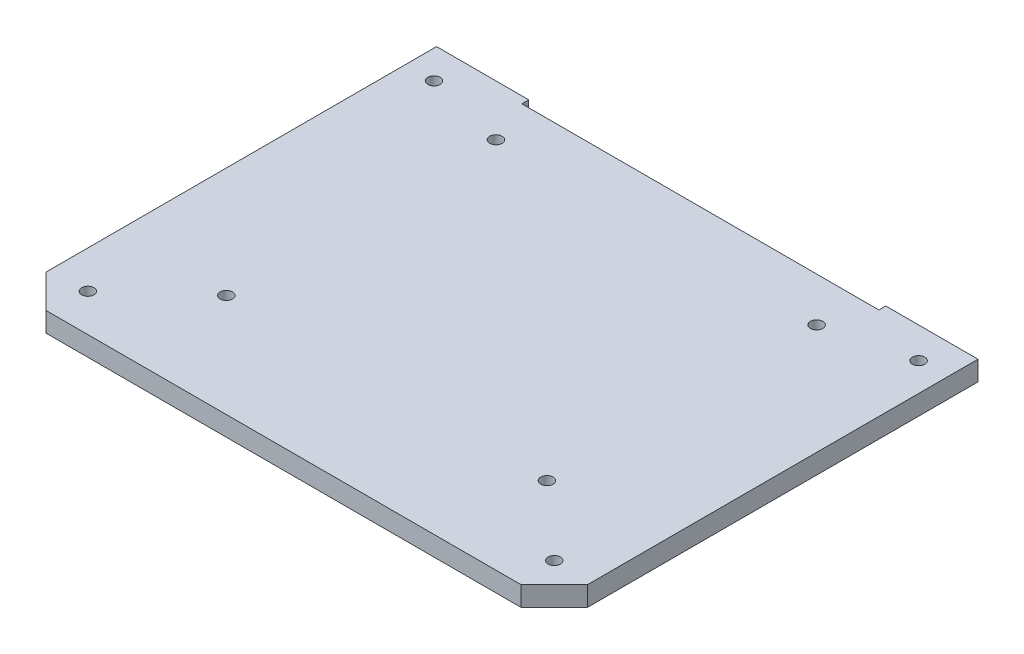
ISO-10303-21;
HEADER;
FILE_DESCRIPTION(('STEP AP214'),'2;1');
FILE_NAME('part.step','',(''),(''),'','','');
FILE_SCHEMA(('AUTOMOTIVE_DESIGN { 1 0 10303 214 1 1 1 1 }'));
ENDSEC;
DATA;
#1=APPLICATION_CONTEXT('core data for automotive mechanical design processes');
#2=APPLICATION_PROTOCOL_DEFINITION('international standard','automotive_design',2000,#1);
#3=PRODUCT_CONTEXT('',#1,'mechanical');
#4=PRODUCT('Part','Part','',(#3));
#5=PRODUCT_RELATED_PRODUCT_CATEGORY('part','',(#4));
#6=PRODUCT_DEFINITION_FORMATION('','',#4);
#7=PRODUCT_DEFINITION_CONTEXT('part definition',#1,'design');
#8=PRODUCT_DEFINITION('design','',#6,#7);
#9=PRODUCT_DEFINITION_SHAPE('','',#8);
#10=(LENGTH_UNIT() NAMED_UNIT(*) SI_UNIT(.MILLI.,.METRE.));
#11=(NAMED_UNIT(*) PLANE_ANGLE_UNIT() SI_UNIT($,.RADIAN.));
#12=(NAMED_UNIT(*) SI_UNIT($,.STERADIAN.) SOLID_ANGLE_UNIT());
#13=UNCERTAINTY_MEASURE_WITH_UNIT(LENGTH_MEASURE(1.E-05),#10,'distance_accuracy_value','');
#14=(GEOMETRIC_REPRESENTATION_CONTEXT(3) GLOBAL_UNCERTAINTY_ASSIGNED_CONTEXT((#13)) GLOBAL_UNIT_ASSIGNED_CONTEXT((#10,
#11,#12)) REPRESENTATION_CONTEXT('',''));
#15=CARTESIAN_POINT('',(0.,0.,0.));
#16=DIRECTION('',(0.,0.,1.));
#17=DIRECTION('',(1.,0.,0.));
#18=AXIS2_PLACEMENT_3D('',#15,#16,#17);
#19=CARTESIAN_POINT('',(74.3,30.4,11.9));
#20=DIRECTION('',(0.,0.,1.));
#21=DIRECTION('',(1.,0.,0.));
#22=AXIS2_PLACEMENT_3D('',#19,#20,#21);
#23=PLANE('',#22);
#24=DIRECTION('',(0.,-1.,0.));
#25=VECTOR('',#24,1.);
#26=CARTESIAN_POINT('',(49.,30.4,11.9));
#27=LINE('',#26,#25);
#28=CARTESIAN_POINT('',(49.,30.4,11.9));
#29=VERTEX_POINT('',#28);
#30=CARTESIAN_POINT('',(49.,28.,11.9));
#31=VERTEX_POINT('',#30);
#32=EDGE_CURVE('E56',#29,#31,#27,.T.);
#33=ORIENTED_EDGE('',*,*,#32,.T.);
#34=DIRECTION('',(-1.,0.,0.));
#35=VECTOR('',#34,1.);
#36=CARTESIAN_POINT('',(74.3,28.,11.9));
#37=LINE('',#36,#35);
#38=CARTESIAN_POINT('',(-49.,28.,11.9));
#39=VERTEX_POINT('',#38);
#40=EDGE_CURVE('E275',#31,#39,#37,.T.);
#41=ORIENTED_EDGE('',*,*,#40,.T.);
#42=DIRECTION('',(0.,-1.,0.));
#43=VECTOR('',#42,1.);
#44=CARTESIAN_POINT('',(-49.,30.4,11.9));
#45=LINE('',#44,#43);
#46=CARTESIAN_POINT('',(-49.,30.4,11.9));
#47=VERTEX_POINT('',#46);
#48=EDGE_CURVE('E218',#47,#39,#45,.T.);
#49=ORIENTED_EDGE('',*,*,#48,.F.);
#50=DIRECTION('',(-1.,0.,0.));
#51=VECTOR('',#50,1.);
#52=CARTESIAN_POINT('',(74.3,30.4,11.9));
#53=LINE('',#52,#51);
#54=EDGE_CURVE('E61',#29,#47,#53,.T.);
#55=ORIENTED_EDGE('',*,*,#54,.F.);
#56=EDGE_LOOP('',(#33,#41,#49,#55));
#57=FACE_BOUND('',#56,.T.);
#58=ADVANCED_FACE('F39',(#57),#23,.F.);
#59=CARTESIAN_POINT('',(0.,28.,0.));
#60=DIRECTION('',(0.,1.,0.));
#61=DIRECTION('',(0.,0.,1.));
#62=AXIS2_PLACEMENT_3D('',#59,#60,#61);
#63=PLANE('',#62);
#64=CARTESIAN_POINT('',(-44.,28.,24.));
#65=DIRECTION('',(0.,1.,0.));
#66=DIRECTION('',(0.,0.,1.));
#67=AXIS2_PLACEMENT_3D('',#64,#65,#66);
#68=CIRCLE('',#67,1.7);
#69=CARTESIAN_POINT('',(-44.,28.,25.7));
#70=VERTEX_POINT('',#69);
#71=EDGE_CURVE('E193',#70,#70,#68,.F.);
#72=ORIENTED_EDGE('',*,*,#71,.F.);
#73=EDGE_LOOP('',(#72));
#74=FACE_BOUND('',#73,.T.);
#75=CARTESIAN_POINT('',(64.,28.,116.));
#76=DIRECTION('',(0.,1.,0.));
#77=DIRECTION('',(0.,0.,1.));
#78=AXIS2_PLACEMENT_3D('',#75,#76,#77);
#79=CIRCLE('',#78,1.69999999999999);
#80=CARTESIAN_POINT('',(64.,28.,117.7));
#81=VERTEX_POINT('',#80);
#82=EDGE_CURVE('E315',#81,#81,#79,.F.);
#83=ORIENTED_EDGE('',*,*,#82,.F.);
#84=EDGE_LOOP('',(#83));
#85=FACE_BOUND('',#84,.T.);
#86=CARTESIAN_POINT('',(-64.,28.,116.));
#87=DIRECTION('',(0.,1.,0.));
#88=DIRECTION('',(0.,0.,1.));
#89=AXIS2_PLACEMENT_3D('',#86,#87,#88);
#90=CIRCLE('',#89,1.7);
#91=CARTESIAN_POINT('',(-64.,28.,117.7));
#92=VERTEX_POINT('',#91);
#93=EDGE_CURVE('E312',#92,#92,#90,.F.);
#94=ORIENTED_EDGE('',*,*,#93,.F.);
#95=EDGE_LOOP('',(#94));
#96=FACE_BOUND('',#95,.T.);
#97=CARTESIAN_POINT('',(66.5,28.,18.5));
#98=DIRECTION('',(0.,1.,0.));
#99=DIRECTION('',(0.,0.,1.));
#100=AXIS2_PLACEMENT_3D('',#97,#98,#99);
#101=CIRCLE('',#100,1.69999999999999);
#102=CARTESIAN_POINT('',(66.5,28.,20.2));
#103=VERTEX_POINT('',#102);
#104=EDGE_CURVE('E309',#103,#103,#101,.F.);
#105=ORIENTED_EDGE('',*,*,#104,.F.);
#106=EDGE_LOOP('',(#105));
#107=FACE_BOUND('',#106,.T.);
#108=CARTESIAN_POINT('',(44.,28.,98.));
#109=DIRECTION('',(0.,1.,0.));
#110=DIRECTION('',(0.,0.,1.));
#111=AXIS2_PLACEMENT_3D('',#108,#109,#110);
#112=CIRCLE('',#111,1.7);
#113=CARTESIAN_POINT('',(44.,28.,99.7));
#114=VERTEX_POINT('',#113);
#115=EDGE_CURVE('E305',#114,#114,#112,.F.);
#116=ORIENTED_EDGE('',*,*,#115,.F.);
#117=EDGE_LOOP('',(#116));
#118=FACE_BOUND('',#117,.T.);
#119=CARTESIAN_POINT('',(44.,28.,24.));
#120=DIRECTION('',(0.,1.,0.));
#121=DIRECTION('',(0.,0.,1.));
#122=AXIS2_PLACEMENT_3D('',#119,#120,#121);
#123=CIRCLE('',#122,1.7);
#124=CARTESIAN_POINT('',(44.,28.,25.7));
#125=VERTEX_POINT('',#124);
#126=EDGE_CURVE('E301',#125,#125,#123,.F.);
#127=ORIENTED_EDGE('',*,*,#126,.F.);
#128=EDGE_LOOP('',(#127));
#129=FACE_BOUND('',#128,.T.);
#130=CARTESIAN_POINT('',(-44.,28.,98.));
#131=DIRECTION('',(0.,1.,0.));
#132=DIRECTION('',(0.,0.,1.));
#133=AXIS2_PLACEMENT_3D('',#130,#131,#132);
#134=CIRCLE('',#133,1.7);
#135=CARTESIAN_POINT('',(-44.,28.,99.7));
#136=VERTEX_POINT('',#135);
#137=EDGE_CURVE('E297',#136,#136,#134,.F.);
#138=ORIENTED_EDGE('',*,*,#137,.F.);
#139=EDGE_LOOP('',(#138));
#140=FACE_BOUND('',#139,.T.);
#141=CARTESIAN_POINT('',(-66.5,28.,18.5));
#142=DIRECTION('',(0.,1.,0.));
#143=DIRECTION('',(0.,0.,1.));
#144=AXIS2_PLACEMENT_3D('',#141,#142,#143);
#145=CIRCLE('',#144,1.69999999999999);
#146=CARTESIAN_POINT('',(-66.5,28.,20.2));
#147=VERTEX_POINT('',#146);
#148=EDGE_CURVE('E293',#147,#147,#145,.F.);
#149=ORIENTED_EDGE('',*,*,#148,.F.);
#150=EDGE_LOOP('',(#149));
#151=FACE_BOUND('',#150,.T.);
#152=DIRECTION('',(0.,0.,-1.));
#153=VECTOR('',#152,1.);
#154=CARTESIAN_POINT('',(72.7,28.,0.));
#155=LINE('',#154,#153);
#156=CARTESIAN_POINT('',(72.7,28.,116.524264068712));
#157=VERTEX_POINT('',#156);
#158=CARTESIAN_POINT('',(72.7,28.,11.9));
#159=VERTEX_POINT('',#158);
#160=EDGE_CURVE('E11',#157,#159,#155,.T.);
#161=ORIENTED_EDGE('',*,*,#160,.F.);
#162=DIRECTION('',(0.707106781186547,0.,-0.707106781186548));
#163=VECTOR('',#162,1.);
#164=CARTESIAN_POINT('',(94.612132034356,28.,94.6121320343559));
#165=LINE('',#164,#163);
#166=CARTESIAN_POINT('',(64.5242640687119,28.,124.7));
#167=VERTEX_POINT('',#166);
#168=EDGE_CURVE('E48',#167,#157,#165,.T.);
#169=ORIENTED_EDGE('',*,*,#168,.F.);
#170=DIRECTION('',(1.,0.,0.));
#171=VECTOR('',#170,1.);
#172=CARTESIAN_POINT('',(0.,28.,124.7));
#173=LINE('',#172,#171);
#174=CARTESIAN_POINT('',(-64.5242640687119,28.,124.7));
#175=VERTEX_POINT('',#174);
#176=EDGE_CURVE('E287',#175,#167,#173,.T.);
#177=ORIENTED_EDGE('',*,*,#176,.F.);
#178=DIRECTION('',(0.707106781186547,0.,0.707106781186548));
#179=VECTOR('',#178,1.);
#180=CARTESIAN_POINT('',(-94.612132034356,28.,94.6121320343559));
#181=LINE('',#180,#179);
#182=CARTESIAN_POINT('',(-72.7,28.,116.524264068712));
#183=VERTEX_POINT('',#182);
#184=EDGE_CURVE('E285',#183,#175,#181,.T.);
#185=ORIENTED_EDGE('',*,*,#184,.F.);
#186=DIRECTION('',(0.,0.,1.));
#187=VECTOR('',#186,1.);
#188=CARTESIAN_POINT('',(-72.7,28.,0.));
#189=LINE('',#188,#187);
#190=CARTESIAN_POINT('',(-72.7,28.,11.9));
#191=VERTEX_POINT('',#190);
#192=EDGE_CURVE('E283',#191,#183,#189,.T.);
#193=ORIENTED_EDGE('',*,*,#192,.F.);
#194=EDGE_CURVE('E262',#39,#191,#37,.T.);
#195=ORIENTED_EDGE('',*,*,#194,.F.);
#196=ORIENTED_EDGE('',*,*,#40,.F.);
#197=EDGE_CURVE('E266',#159,#31,#37,.T.);
#198=ORIENTED_EDGE('',*,*,#197,.F.);
#199=EDGE_LOOP('',(#161,#169,#177,#185,#193,#195,#196,#198));
#200=FACE_BOUND('',#199,.T.);
#201=ADVANCED_FACE('F345',(#74,#85,#96,#107,#118,#129,#140,#151,#200),#63,.F.);
#202=CARTESIAN_POINT('',(-74.3,30.4,117.187005768509));
#203=DIRECTION('',(0.707106781186548,0.,-0.707106781186547));
#204=DIRECTION('',(-0.707106781186547,0.,-0.707106781186548));
#205=AXIS2_PLACEMENT_3D('',#202,#203,#204);
#206=PLANE('',#205);
#207=DIRECTION('',(0.707106781186547,0.,0.707106781186548));
#208=VECTOR('',#207,1.);
#209=CARTESIAN_POINT('',(-65.1870057685089,25.,126.3));
#210=LINE('',#209,#208);
#211=CARTESIAN_POINT('',(-74.3,25.,117.187005768509));
#212=VERTEX_POINT('',#211);
#213=CARTESIAN_POINT('',(-65.1870057685089,25.,126.3));
#214=VERTEX_POINT('',#213);
#215=EDGE_CURVE('E238',#212,#214,#210,.T.);
#216=ORIENTED_EDGE('',*,*,#215,.T.);
#217=DIRECTION('',(0.,-1.,0.));
#218=VECTOR('',#217,1.);
#219=CARTESIAN_POINT('',(-65.1870057685089,30.4,126.3));
#220=LINE('',#219,#218);
#221=CARTESIAN_POINT('',(-65.1870057685089,30.4,126.3));
#222=VERTEX_POINT('',#221);
#223=EDGE_CURVE('E281',#222,#214,#220,.T.);
#224=ORIENTED_EDGE('',*,*,#223,.F.);
#225=DIRECTION('',(0.707106781186547,0.,0.707106781186548));
#226=VECTOR('',#225,1.);
#227=CARTESIAN_POINT('',(-74.3,30.4,117.187005768509));
#228=LINE('',#227,#226);
#229=CARTESIAN_POINT('',(-74.3,30.4,117.187005768509));
#230=VERTEX_POINT('',#229);
#231=EDGE_CURVE('E263',#230,#222,#228,.T.);
#232=ORIENTED_EDGE('',*,*,#231,.F.);
#233=DIRECTION('',(0.,-1.,0.));
#234=VECTOR('',#233,1.);
#235=CARTESIAN_POINT('',(-74.3,30.4,117.187005768509));
#236=LINE('',#235,#234);
#237=EDGE_CURVE('E272',#230,#212,#236,.T.);
#238=ORIENTED_EDGE('',*,*,#237,.T.);
#239=EDGE_LOOP('',(#216,#224,#232,#238));
#240=FACE_BOUND('',#239,.T.);
#241=ADVANCED_FACE('F41',(#240),#206,.F.);
#242=CARTESIAN_POINT('',(-65.1870057685089,30.4,126.3));
#243=DIRECTION('',(0.,0.,-1.));
#244=DIRECTION('',(-1.,0.,0.));
#245=AXIS2_PLACEMENT_3D('',#242,#243,#244);
#246=PLANE('',#245);
#247=DIRECTION('',(1.,0.,0.));
#248=VECTOR('',#247,1.);
#249=CARTESIAN_POINT('',(65.1870057685089,25.,126.3));
#250=LINE('',#249,#248);
#251=CARTESIAN_POINT('',(65.1870057685089,25.,126.3));
#252=VERTEX_POINT('',#251);
#253=EDGE_CURVE('E241',#214,#252,#250,.T.);
#254=ORIENTED_EDGE('',*,*,#253,.T.);
#255=DIRECTION('',(0.,-1.,0.));
#256=VECTOR('',#255,1.);
#257=CARTESIAN_POINT('',(65.1870057685089,30.4,126.3));
#258=LINE('',#257,#256);
#259=CARTESIAN_POINT('',(65.1870057685089,30.4,126.3));
#260=VERTEX_POINT('',#259);
#261=EDGE_CURVE('E279',#260,#252,#258,.T.);
#262=ORIENTED_EDGE('',*,*,#261,.F.);
#263=DIRECTION('',(1.,0.,0.));
#264=VECTOR('',#263,1.);
#265=CARTESIAN_POINT('',(-65.1870057685089,30.4,126.3));
#266=LINE('',#265,#264);
#267=EDGE_CURVE('E265',#222,#260,#266,.T.);
#268=ORIENTED_EDGE('',*,*,#267,.F.);
#269=ORIENTED_EDGE('',*,*,#223,.T.);
#270=EDGE_LOOP('',(#254,#262,#268,#269));
#271=FACE_BOUND('',#270,.T.);
#272=ADVANCED_FACE('F360',(#271),#246,.F.);
#273=CARTESIAN_POINT('',(65.1870057685089,30.4,126.3));
#274=DIRECTION('',(-0.707106781186548,0.,-0.707106781186547));
#275=DIRECTION('',(-0.707106781186547,0.,0.707106781186548));
#276=AXIS2_PLACEMENT_3D('',#273,#274,#275);
#277=PLANE('',#276);
#278=DIRECTION('',(0.707106781186547,0.,-0.707106781186548));
#279=VECTOR('',#278,1.);
#280=CARTESIAN_POINT('',(74.3,25.,117.187005768509));
#281=LINE('',#280,#279);
#282=CARTESIAN_POINT('',(74.3,25.,117.187005768509));
#283=VERTEX_POINT('',#282);
#284=EDGE_CURVE('E244',#252,#283,#281,.T.);
#285=ORIENTED_EDGE('',*,*,#284,.T.);
#286=DIRECTION('',(0.,-1.,0.));
#287=VECTOR('',#286,1.);
#288=CARTESIAN_POINT('',(74.3,30.4,117.187005768509));
#289=LINE('',#288,#287);
#290=CARTESIAN_POINT('',(74.3,30.4,117.187005768509));
#291=VERTEX_POINT('',#290);
#292=EDGE_CURVE('E277',#291,#283,#289,.T.);
#293=ORIENTED_EDGE('',*,*,#292,.F.);
#294=DIRECTION('',(0.707106781186547,0.,-0.707106781186548));
#295=VECTOR('',#294,1.);
#296=CARTESIAN_POINT('',(65.1870057685089,30.4,126.3));
#297=LINE('',#296,#295);
#298=EDGE_CURVE('E165',#260,#291,#297,.T.);
#299=ORIENTED_EDGE('',*,*,#298,.F.);
#300=ORIENTED_EDGE('',*,*,#261,.T.);
#301=EDGE_LOOP('',(#285,#293,#299,#300));
#302=FACE_BOUND('',#301,.T.);
#303=ADVANCED_FACE('F358',(#302),#277,.F.);
#304=CARTESIAN_POINT('',(74.3,30.4,117.187005768509));
#305=DIRECTION('',(-1.,0.,0.));
#306=DIRECTION('',(0.,0.,1.));
#307=AXIS2_PLACEMENT_3D('',#304,#305,#306);
#308=PLANE('',#307);
#309=DIRECTION('',(0.,0.,-1.));
#310=VECTOR('',#309,1.);
#311=CARTESIAN_POINT('',(74.3,25.,11.9));
#312=LINE('',#311,#310);
#313=CARTESIAN_POINT('',(74.3,25.,10.));
#314=VERTEX_POINT('',#313);
#315=EDGE_CURVE('E173',#283,#314,#312,.T.);
#316=ORIENTED_EDGE('',*,*,#315,.T.);
#317=DIRECTION('',(0.,-1.,0.));
#318=VECTOR('',#317,1.);
#319=CARTESIAN_POINT('',(74.3,30.4,10.));
#320=LINE('',#319,#318);
#321=CARTESIAN_POINT('',(74.3,30.4,10.));
#322=VERTEX_POINT('',#321);
#323=EDGE_CURVE('E170',#322,#314,#320,.T.);
#324=ORIENTED_EDGE('',*,*,#323,.F.);
#325=DIRECTION('',(0.,0.,-1.));
#326=VECTOR('',#325,1.);
#327=CARTESIAN_POINT('',(74.3,30.4,117.187005768509));
#328=LINE('',#327,#326);
#329=EDGE_CURVE('E157',#291,#322,#328,.T.);
#330=ORIENTED_EDGE('',*,*,#329,.F.);
#331=ORIENTED_EDGE('',*,*,#292,.T.);
#332=EDGE_LOOP('',(#316,#324,#330,#331));
#333=FACE_BOUND('',#332,.T.);
#334=ADVANCED_FACE('F171',(#333),#308,.F.);
#335=CARTESIAN_POINT('',(-74.3,30.4,11.9));
#336=DIRECTION('',(1.,0.,0.));
#337=DIRECTION('',(0.,0.,-1.));
#338=AXIS2_PLACEMENT_3D('',#335,#336,#337);
#339=PLANE('',#338);
#340=DIRECTION('',(0.,0.,1.));
#341=VECTOR('',#340,1.);
#342=CARTESIAN_POINT('',(-74.3,25.,117.187005768509));
#343=LINE('',#342,#341);
#344=CARTESIAN_POINT('',(-74.3,25.,10.));
#345=VERTEX_POINT('',#344);
#346=EDGE_CURVE('E235',#345,#212,#343,.T.);
#347=ORIENTED_EDGE('',*,*,#346,.T.);
#348=ORIENTED_EDGE('',*,*,#237,.F.);
#349=DIRECTION('',(0.,0.,1.));
#350=VECTOR('',#349,1.);
#351=CARTESIAN_POINT('',(-74.3,30.4,11.9));
#352=LINE('',#351,#350);
#353=CARTESIAN_POINT('',(-74.3,30.4,10.));
#354=VERTEX_POINT('',#353);
#355=EDGE_CURVE('E270',#354,#230,#352,.T.);
#356=ORIENTED_EDGE('',*,*,#355,.F.);
#357=DIRECTION('',(0.,-1.,0.));
#358=VECTOR('',#357,1.);
#359=CARTESIAN_POINT('',(-74.3,30.4,10.));
#360=LINE('',#359,#358);
#361=EDGE_CURVE('E205',#354,#345,#360,.T.);
#362=ORIENTED_EDGE('',*,*,#361,.T.);
#363=EDGE_LOOP('',(#347,#348,#356,#362));
#364=FACE_BOUND('',#363,.T.);
#365=ADVANCED_FACE('F356',(#364),#339,.F.);
#366=CARTESIAN_POINT('',(0.,30.4,0.));
#367=DIRECTION('',(0.,1.,0.));
#368=DIRECTION('',(0.,0.,1.));
#369=AXIS2_PLACEMENT_3D('',#366,#367,#368);
#370=PLANE('',#369);
#371=CARTESIAN_POINT('',(-44.,30.4,24.));
#372=DIRECTION('',(0.,1.,0.));
#373=DIRECTION('',(0.,0.,1.));
#374=AXIS2_PLACEMENT_3D('',#371,#372,#373);
#375=CIRCLE('',#374,1.7);
#376=CARTESIAN_POINT('',(-44.,30.4,25.7));
#377=VERTEX_POINT('',#376);
#378=EDGE_CURVE('E43',#377,#377,#375,.F.);
#379=ORIENTED_EDGE('',*,*,#378,.T.);
#380=EDGE_LOOP('',(#379));
#381=FACE_BOUND('',#380,.T.);
#382=CARTESIAN_POINT('',(64.,30.4,116.));
#383=DIRECTION('',(0.,1.,0.));
#384=DIRECTION('',(0.,0.,1.));
#385=AXIS2_PLACEMENT_3D('',#382,#383,#384);
#386=CIRCLE('',#385,1.69999999999999);
#387=CARTESIAN_POINT('',(64.,30.4,117.7));
#388=VERTEX_POINT('',#387);
#389=EDGE_CURVE('E313',#388,#388,#386,.F.);
#390=ORIENTED_EDGE('',*,*,#389,.T.);
#391=EDGE_LOOP('',(#390));
#392=FACE_BOUND('',#391,.T.);
#393=CARTESIAN_POINT('',(-64.,30.4,116.));
#394=DIRECTION('',(0.,1.,0.));
#395=DIRECTION('',(0.,0.,1.));
#396=AXIS2_PLACEMENT_3D('',#393,#394,#395);
#397=CIRCLE('',#396,1.7);
#398=CARTESIAN_POINT('',(-64.,30.4,117.7));
#399=VERTEX_POINT('',#398);
#400=EDGE_CURVE('E310',#399,#399,#397,.F.);
#401=ORIENTED_EDGE('',*,*,#400,.T.);
#402=EDGE_LOOP('',(#401));
#403=FACE_BOUND('',#402,.T.);
#404=CARTESIAN_POINT('',(66.5,30.4,18.5));
#405=DIRECTION('',(0.,1.,0.));
#406=DIRECTION('',(0.,0.,1.));
#407=AXIS2_PLACEMENT_3D('',#404,#405,#406);
#408=CIRCLE('',#407,1.69999999999999);
#409=CARTESIAN_POINT('',(66.5,30.4,20.2));
#410=VERTEX_POINT('',#409);
#411=EDGE_CURVE('E306',#410,#410,#408,.F.);
#412=ORIENTED_EDGE('',*,*,#411,.T.);
#413=EDGE_LOOP('',(#412));
#414=FACE_BOUND('',#413,.T.);
#415=CARTESIAN_POINT('',(44.,30.4,98.));
#416=DIRECTION('',(0.,1.,0.));
#417=DIRECTION('',(0.,0.,1.));
#418=AXIS2_PLACEMENT_3D('',#415,#416,#417);
#419=CIRCLE('',#418,1.7);
#420=CARTESIAN_POINT('',(44.,30.4,99.7));
#421=VERTEX_POINT('',#420);
#422=EDGE_CURVE('E302',#421,#421,#419,.F.);
#423=ORIENTED_EDGE('',*,*,#422,.T.);
#424=EDGE_LOOP('',(#423));
#425=FACE_BOUND('',#424,.T.);
#426=CARTESIAN_POINT('',(44.,30.4,24.));
#427=DIRECTION('',(0.,1.,0.));
#428=DIRECTION('',(0.,0.,1.));
#429=AXIS2_PLACEMENT_3D('',#426,#427,#428);
#430=CIRCLE('',#429,1.7);
#431=CARTESIAN_POINT('',(44.,30.4,25.7));
#432=VERTEX_POINT('',#431);
#433=EDGE_CURVE('E298',#432,#432,#430,.F.);
#434=ORIENTED_EDGE('',*,*,#433,.T.);
#435=EDGE_LOOP('',(#434));
#436=FACE_BOUND('',#435,.T.);
#437=CARTESIAN_POINT('',(-44.,30.4,98.));
#438=DIRECTION('',(0.,1.,0.));
#439=DIRECTION('',(0.,0.,1.));
#440=AXIS2_PLACEMENT_3D('',#437,#438,#439);
#441=CIRCLE('',#440,1.7);
#442=CARTESIAN_POINT('',(-44.,30.4,99.7));
#443=VERTEX_POINT('',#442);
#444=EDGE_CURVE('E294',#443,#443,#441,.F.);
#445=ORIENTED_EDGE('',*,*,#444,.T.);
#446=EDGE_LOOP('',(#445));
#447=FACE_BOUND('',#446,.T.);
#448=CARTESIAN_POINT('',(-66.5,30.4,18.5));
#449=DIRECTION('',(0.,1.,0.));
#450=DIRECTION('',(0.,0.,1.));
#451=AXIS2_PLACEMENT_3D('',#448,#449,#450);
#452=CIRCLE('',#451,1.69999999999999);
#453=CARTESIAN_POINT('',(-66.5,30.4,20.2));
#454=VERTEX_POINT('',#453);
#455=EDGE_CURVE('E290',#454,#454,#452,.F.);
#456=ORIENTED_EDGE('',*,*,#455,.T.);
#457=EDGE_LOOP('',(#456));
#458=FACE_BOUND('',#457,.T.);
#459=ORIENTED_EDGE('',*,*,#231,.T.);
#460=ORIENTED_EDGE('',*,*,#267,.T.);
#461=ORIENTED_EDGE('',*,*,#298,.T.);
#462=ORIENTED_EDGE('',*,*,#329,.T.);
#463=DIRECTION('',(-1.,0.,0.));
#464=VECTOR('',#463,1.);
#465=CARTESIAN_POINT('',(74.3,30.4,10.));
#466=LINE('',#465,#464);
#467=CARTESIAN_POINT('',(49.,30.4,10.));
#468=VERTEX_POINT('',#467);
#469=EDGE_CURVE('E162',#322,#468,#466,.T.);
#470=ORIENTED_EDGE('',*,*,#469,.T.);
#471=DIRECTION('',(0.,0.,1.));
#472=VECTOR('',#471,1.);
#473=CARTESIAN_POINT('',(49.,30.4,10.));
#474=LINE('',#473,#472);
#475=EDGE_CURVE('E182',#468,#29,#474,.T.);
#476=ORIENTED_EDGE('',*,*,#475,.T.);
#477=ORIENTED_EDGE('',*,*,#54,.T.);
#478=DIRECTION('',(0.,0.,-1.));
#479=VECTOR('',#478,1.);
#480=CARTESIAN_POINT('',(-49.,30.4,11.9));
#481=LINE('',#480,#479);
#482=CARTESIAN_POINT('',(-49.,30.4,10.));
#483=VERTEX_POINT('',#482);
#484=EDGE_CURVE('E199',#47,#483,#481,.T.);
#485=ORIENTED_EDGE('',*,*,#484,.T.);
#486=DIRECTION('',(-1.,0.,0.));
#487=VECTOR('',#486,1.);
#488=CARTESIAN_POINT('',(-49.,30.4,10.));
#489=LINE('',#488,#487);
#490=EDGE_CURVE('E201',#483,#354,#489,.T.);
#491=ORIENTED_EDGE('',*,*,#490,.T.);
#492=ORIENTED_EDGE('',*,*,#355,.T.);
#493=EDGE_LOOP('',(#459,#460,#461,#462,#470,#476,#477,#485,#491,#492));
#494=FACE_BOUND('',#493,.T.);
#495=ADVANCED_FACE('F160',(#381,#392,#403,#414,#425,#436,#447,#458,#494),#370,.T.);
#496=CARTESIAN_POINT('',(72.7,28.01,116.524264068712));
#497=DIRECTION('',(1.,0.,0.));
#498=DIRECTION('',(0.,0.,-1.));
#499=AXIS2_PLACEMENT_3D('',#496,#497,#498);
#500=PLANE('',#499);
#501=DIRECTION('',(0.,-1.,0.));
#502=VECTOR('',#501,1.);
#503=CARTESIAN_POINT('',(72.7,28.01,116.524264068712));
#504=LINE('',#503,#502);
#505=CARTESIAN_POINT('',(72.7,25.,116.524264068712));
#506=VERTEX_POINT('',#505);
#507=EDGE_CURVE('E257',#157,#506,#504,.T.);
#508=ORIENTED_EDGE('',*,*,#507,.F.);
#509=ORIENTED_EDGE('',*,*,#160,.T.);
#510=DIRECTION('',(0.,-1.,0.));
#511=VECTOR('',#510,1.);
#512=CARTESIAN_POINT('',(72.7,28.01,11.9));
#513=LINE('',#512,#511);
#514=CARTESIAN_POINT('',(72.7,25.,11.9));
#515=VERTEX_POINT('',#514);
#516=EDGE_CURVE('E259',#159,#515,#513,.T.);
#517=ORIENTED_EDGE('',*,*,#516,.T.);
#518=DIRECTION('',(0.,0.,1.));
#519=VECTOR('',#518,1.);
#520=CARTESIAN_POINT('',(72.7,25.,116.524264068712));
#521=LINE('',#520,#519);
#522=EDGE_CURVE('E221',#515,#506,#521,.T.);
#523=ORIENTED_EDGE('',*,*,#522,.T.);
#524=EDGE_LOOP('',(#508,#509,#517,#523));
#525=FACE_BOUND('',#524,.T.);
#526=ADVANCED_FACE('F422',(#525),#500,.F.);
#527=CARTESIAN_POINT('',(64.5242640687119,28.01,124.7));
#528=DIRECTION('',(0.707106781186548,0.,0.707106781186547));
#529=DIRECTION('',(0.707106781186547,0.,-0.707106781186548));
#530=AXIS2_PLACEMENT_3D('',#527,#528,#529);
#531=PLANE('',#530);
#532=DIRECTION('',(0.,-1.,0.));
#533=VECTOR('',#532,1.);
#534=CARTESIAN_POINT('',(64.5242640687119,28.01,124.7));
#535=LINE('',#534,#533);
#536=CARTESIAN_POINT('',(64.5242640687119,25.,124.7));
#537=VERTEX_POINT('',#536);
#538=EDGE_CURVE('E255',#167,#537,#535,.T.);
#539=ORIENTED_EDGE('',*,*,#538,.F.);
#540=ORIENTED_EDGE('',*,*,#168,.T.);
#541=ORIENTED_EDGE('',*,*,#507,.T.);
#542=DIRECTION('',(-0.707106781186547,0.,0.707106781186548));
#543=VECTOR('',#542,1.);
#544=CARTESIAN_POINT('',(64.5242640687119,25.,124.7));
#545=LINE('',#544,#543);
#546=EDGE_CURVE('E224',#506,#537,#545,.T.);
#547=ORIENTED_EDGE('',*,*,#546,.T.);
#548=EDGE_LOOP('',(#539,#540,#541,#547));
#549=FACE_BOUND('',#548,.T.);
#550=ADVANCED_FACE('F419',(#549),#531,.F.);
#551=CARTESIAN_POINT('',(-64.5242640687119,28.01,124.7));
#552=DIRECTION('',(0.,0.,1.));
#553=DIRECTION('',(1.,0.,0.));
#554=AXIS2_PLACEMENT_3D('',#551,#552,#553);
#555=PLANE('',#554);
#556=DIRECTION('',(0.,-1.,0.));
#557=VECTOR('',#556,1.);
#558=CARTESIAN_POINT('',(-64.5242640687119,28.01,124.7));
#559=LINE('',#558,#557);
#560=CARTESIAN_POINT('',(-64.5242640687119,25.,124.7));
#561=VERTEX_POINT('',#560);
#562=EDGE_CURVE('E253',#175,#561,#559,.T.);
#563=ORIENTED_EDGE('',*,*,#562,.F.);
#564=ORIENTED_EDGE('',*,*,#176,.T.);
#565=ORIENTED_EDGE('',*,*,#538,.T.);
#566=DIRECTION('',(-1.,0.,0.));
#567=VECTOR('',#566,1.);
#568=CARTESIAN_POINT('',(-64.5242640687119,25.,124.7));
#569=LINE('',#568,#567);
#570=EDGE_CURVE('E227',#537,#561,#569,.T.);
#571=ORIENTED_EDGE('',*,*,#570,.T.);
#572=EDGE_LOOP('',(#563,#564,#565,#571));
#573=FACE_BOUND('',#572,.T.);
#574=ADVANCED_FACE('F414',(#573),#555,.F.);
#575=CARTESIAN_POINT('',(-72.7,28.01,116.524264068712));
#576=DIRECTION('',(-0.707106781186548,0.,0.707106781186547));
#577=DIRECTION('',(0.707106781186547,0.,0.707106781186548));
#578=AXIS2_PLACEMENT_3D('',#575,#576,#577);
#579=PLANE('',#578);
#580=DIRECTION('',(0.,-1.,0.));
#581=VECTOR('',#580,1.);
#582=CARTESIAN_POINT('',(-72.7,28.01,116.524264068712));
#583=LINE('',#582,#581);
#584=CARTESIAN_POINT('',(-72.7,25.,116.524264068712));
#585=VERTEX_POINT('',#584);
#586=EDGE_CURVE('E251',#183,#585,#583,.T.);
#587=ORIENTED_EDGE('',*,*,#586,.F.);
#588=ORIENTED_EDGE('',*,*,#184,.T.);
#589=ORIENTED_EDGE('',*,*,#562,.T.);
#590=DIRECTION('',(-0.707106781186547,0.,-0.707106781186548));
#591=VECTOR('',#590,1.);
#592=CARTESIAN_POINT('',(-72.7,25.,116.524264068712));
#593=LINE('',#592,#591);
#594=EDGE_CURVE('E230',#561,#585,#593,.T.);
#595=ORIENTED_EDGE('',*,*,#594,.T.);
#596=EDGE_LOOP('',(#587,#588,#589,#595));
#597=FACE_BOUND('',#596,.T.);
#598=ADVANCED_FACE('F412',(#597),#579,.F.);
#599=CARTESIAN_POINT('',(-72.7,28.01,11.9));
#600=DIRECTION('',(-1.,0.,0.));
#601=DIRECTION('',(0.,0.,1.));
#602=AXIS2_PLACEMENT_3D('',#599,#600,#601);
#603=PLANE('',#602);
#604=DIRECTION('',(0.,-1.,0.));
#605=VECTOR('',#604,1.);
#606=CARTESIAN_POINT('',(-72.7,28.01,11.9));
#607=LINE('',#606,#605);
#608=CARTESIAN_POINT('',(-72.7,25.,11.9));
#609=VERTEX_POINT('',#608);
#610=EDGE_CURVE('E248',#191,#609,#607,.T.);
#611=ORIENTED_EDGE('',*,*,#610,.F.);
#612=ORIENTED_EDGE('',*,*,#192,.T.);
#613=ORIENTED_EDGE('',*,*,#586,.T.);
#614=DIRECTION('',(0.,0.,-1.));
#615=VECTOR('',#614,1.);
#616=CARTESIAN_POINT('',(-72.7,25.,11.9));
#617=LINE('',#616,#615);
#618=EDGE_CURVE('E233',#585,#609,#617,.T.);
#619=ORIENTED_EDGE('',*,*,#618,.T.);
#620=EDGE_LOOP('',(#611,#612,#613,#619));
#621=FACE_BOUND('',#620,.T.);
#622=ADVANCED_FACE('F403',(#621),#603,.F.);
#623=CARTESIAN_POINT('',(0.,25.,0.));
#624=DIRECTION('',(0.,-1.,0.));
#625=DIRECTION('',(0.,0.,-1.));
#626=AXIS2_PLACEMENT_3D('',#623,#624,#625);
#627=PLANE('',#626);
#628=ORIENTED_EDGE('',*,*,#522,.F.);
#629=DIRECTION('',(1.,0.,0.));
#630=VECTOR('',#629,1.);
#631=CARTESIAN_POINT('',(49.,25.,11.9));
#632=LINE('',#631,#630);
#633=CARTESIAN_POINT('',(49.,25.,11.9));
#634=VERTEX_POINT('',#633);
#635=EDGE_CURVE('E192',#634,#515,#632,.T.);
#636=ORIENTED_EDGE('',*,*,#635,.F.);
#637=DIRECTION('',(0.,0.,1.));
#638=VECTOR('',#637,1.);
#639=CARTESIAN_POINT('',(49.,25.,10.));
#640=LINE('',#639,#638);
#641=CARTESIAN_POINT('',(49.,25.,10.));
#642=VERTEX_POINT('',#641);
#643=EDGE_CURVE('E189',#642,#634,#640,.T.);
#644=ORIENTED_EDGE('',*,*,#643,.F.);
#645=DIRECTION('',(-1.,0.,0.));
#646=VECTOR('',#645,1.);
#647=CARTESIAN_POINT('',(74.3,25.,10.));
#648=LINE('',#647,#646);
#649=EDGE_CURVE('E185',#314,#642,#648,.T.);
#650=ORIENTED_EDGE('',*,*,#649,.F.);
#651=ORIENTED_EDGE('',*,*,#315,.F.);
#652=ORIENTED_EDGE('',*,*,#284,.F.);
#653=ORIENTED_EDGE('',*,*,#253,.F.);
#654=ORIENTED_EDGE('',*,*,#215,.F.);
#655=ORIENTED_EDGE('',*,*,#346,.F.);
#656=DIRECTION('',(-1.,0.,0.));
#657=VECTOR('',#656,1.);
#658=CARTESIAN_POINT('',(-49.,25.,10.));
#659=LINE('',#658,#657);
#660=CARTESIAN_POINT('',(-49.,25.,10.));
#661=VERTEX_POINT('',#660);
#662=EDGE_CURVE('E202',#661,#345,#659,.T.);
#663=ORIENTED_EDGE('',*,*,#662,.F.);
#664=DIRECTION('',(0.,0.,-1.));
#665=VECTOR('',#664,1.);
#666=CARTESIAN_POINT('',(-49.,25.,11.9));
#667=LINE('',#666,#665);
#668=CARTESIAN_POINT('',(-49.,25.,11.9));
#669=VERTEX_POINT('',#668);
#670=EDGE_CURVE('E208',#669,#661,#667,.T.);
#671=ORIENTED_EDGE('',*,*,#670,.F.);
#672=DIRECTION('',(1.,0.,0.));
#673=VECTOR('',#672,1.);
#674=CARTESIAN_POINT('',(-74.3,25.,11.9));
#675=LINE('',#674,#673);
#676=EDGE_CURVE('E198',#609,#669,#675,.T.);
#677=ORIENTED_EDGE('',*,*,#676,.F.);
#678=ORIENTED_EDGE('',*,*,#618,.F.);
#679=ORIENTED_EDGE('',*,*,#594,.F.);
#680=ORIENTED_EDGE('',*,*,#570,.F.);
#681=ORIENTED_EDGE('',*,*,#546,.F.);
#682=EDGE_LOOP('',(#628,#636,#644,#650,#651,#652,#653,#654,#655,#663,#671,#677,#678,#679,#680,#681));
#683=FACE_BOUND('',#682,.T.);
#684=ADVANCED_FACE('F374',(#683),#627,.T.);
#685=CARTESIAN_POINT('',(-74.3,30.4,11.9));
#686=DIRECTION('',(0.,0.,-1.));
#687=DIRECTION('',(-1.,0.,0.));
#688=AXIS2_PLACEMENT_3D('',#685,#686,#687);
#689=PLANE('',#688);
#690=EDGE_CURVE('E217',#39,#669,#45,.T.);
#691=ORIENTED_EDGE('',*,*,#690,.F.);
#692=ORIENTED_EDGE('',*,*,#194,.T.);
#693=ORIENTED_EDGE('',*,*,#610,.T.);
#694=ORIENTED_EDGE('',*,*,#676,.T.);
#695=EDGE_LOOP('',(#691,#692,#693,#694));
#696=FACE_BOUND('',#695,.T.);
#697=ADVANCED_FACE('F399',(#696),#689,.F.);
#698=CARTESIAN_POINT('',(-49.,30.4,11.9));
#699=DIRECTION('',(-1.,0.,0.));
#700=DIRECTION('',(0.,0.,1.));
#701=AXIS2_PLACEMENT_3D('',#698,#699,#700);
#702=PLANE('',#701);
#703=ORIENTED_EDGE('',*,*,#670,.T.);
#704=DIRECTION('',(0.,-1.,0.));
#705=VECTOR('',#704,1.);
#706=CARTESIAN_POINT('',(-49.,30.4,10.));
#707=LINE('',#706,#705);
#708=EDGE_CURVE('E214',#483,#661,#707,.T.);
#709=ORIENTED_EDGE('',*,*,#708,.F.);
#710=ORIENTED_EDGE('',*,*,#484,.F.);
#711=ORIENTED_EDGE('',*,*,#48,.T.);
#712=ORIENTED_EDGE('',*,*,#690,.T.);
#713=EDGE_LOOP('',(#703,#709,#710,#711,#712));
#714=FACE_BOUND('',#713,.T.);
#715=ADVANCED_FACE('F384',(#714),#702,.F.);
#716=CARTESIAN_POINT('',(-49.,30.4,10.));
#717=DIRECTION('',(0.,0.,1.));
#718=DIRECTION('',(1.,0.,0.));
#719=AXIS2_PLACEMENT_3D('',#716,#717,#718);
#720=PLANE('',#719);
#721=ORIENTED_EDGE('',*,*,#662,.T.);
#722=ORIENTED_EDGE('',*,*,#361,.F.);
#723=ORIENTED_EDGE('',*,*,#490,.F.);
#724=ORIENTED_EDGE('',*,*,#708,.T.);
#725=EDGE_LOOP('',(#721,#722,#723,#724));
#726=FACE_BOUND('',#725,.T.);
#727=ADVANCED_FACE('F390',(#726),#720,.F.);
#728=CARTESIAN_POINT('',(49.,30.4,11.9));
#729=DIRECTION('',(0.,0.,-1.));
#730=DIRECTION('',(-1.,0.,0.));
#731=AXIS2_PLACEMENT_3D('',#728,#729,#730);
#732=PLANE('',#731);
#733=ORIENTED_EDGE('',*,*,#516,.F.);
#734=ORIENTED_EDGE('',*,*,#197,.T.);
#735=EDGE_CURVE('E176',#31,#634,#27,.T.);
#736=ORIENTED_EDGE('',*,*,#735,.T.);
#737=ORIENTED_EDGE('',*,*,#635,.T.);
#738=EDGE_LOOP('',(#733,#734,#736,#737));
#739=FACE_BOUND('',#738,.T.);
#740=ADVANCED_FACE('F426',(#739),#732,.F.);
#741=CARTESIAN_POINT('',(49.,30.4,10.));
#742=DIRECTION('',(1.,0.,0.));
#743=DIRECTION('',(0.,0.,-1.));
#744=AXIS2_PLACEMENT_3D('',#741,#742,#743);
#745=PLANE('',#744);
#746=ORIENTED_EDGE('',*,*,#643,.T.);
#747=ORIENTED_EDGE('',*,*,#735,.F.);
#748=ORIENTED_EDGE('',*,*,#32,.F.);
#749=ORIENTED_EDGE('',*,*,#475,.F.);
#750=DIRECTION('',(0.,-1.,0.));
#751=VECTOR('',#750,1.);
#752=CARTESIAN_POINT('',(49.,30.4,10.));
#753=LINE('',#752,#751);
#754=EDGE_CURVE('E177',#468,#642,#753,.T.);
#755=ORIENTED_EDGE('',*,*,#754,.T.);
#756=EDGE_LOOP('',(#746,#747,#748,#749,#755));
#757=FACE_BOUND('',#756,.T.);
#758=ADVANCED_FACE('F378',(#757),#745,.F.);
#759=CARTESIAN_POINT('',(74.3,30.4,10.));
#760=DIRECTION('',(0.,0.,1.));
#761=DIRECTION('',(1.,0.,0.));
#762=AXIS2_PLACEMENT_3D('',#759,#760,#761);
#763=PLANE('',#762);
#764=ORIENTED_EDGE('',*,*,#649,.T.);
#765=ORIENTED_EDGE('',*,*,#754,.F.);
#766=ORIENTED_EDGE('',*,*,#469,.F.);
#767=ORIENTED_EDGE('',*,*,#323,.T.);
#768=EDGE_LOOP('',(#764,#765,#766,#767));
#769=FACE_BOUND('',#768,.T.);
#770=ADVANCED_FACE('F179',(#769),#763,.F.);
#771=CARTESIAN_POINT('',(-66.5,31.4,18.5));
#772=DIRECTION('',(0.,-1.,0.));
#773=DIRECTION('',(0.,0.,-1.));
#774=AXIS2_PLACEMENT_3D('',#771,#772,#773);
#775=CYLINDRICAL_SURFACE('',#774,1.69999999999999);
#776=ORIENTED_EDGE('',*,*,#455,.F.);
#777=EDGE_LOOP('',(#776));
#778=FACE_BOUND('',#777,.T.);
#779=ORIENTED_EDGE('',*,*,#148,.T.);
#780=EDGE_LOOP('',(#779));
#781=FACE_BOUND('',#780,.T.);
#782=ADVANCED_FACE('F535',(#778,#781),#775,.F.);
#783=CARTESIAN_POINT('',(-44.,31.4,98.));
#784=DIRECTION('',(0.,-1.,0.));
#785=DIRECTION('',(0.,0.,-1.));
#786=AXIS2_PLACEMENT_3D('',#783,#784,#785);
#787=CYLINDRICAL_SURFACE('',#786,1.7);
#788=ORIENTED_EDGE('',*,*,#444,.F.);
#789=EDGE_LOOP('',(#788));
#790=FACE_BOUND('',#789,.T.);
#791=ORIENTED_EDGE('',*,*,#137,.T.);
#792=EDGE_LOOP('',(#791));
#793=FACE_BOUND('',#792,.T.);
#794=ADVANCED_FACE('F542',(#790,#793),#787,.F.);
#795=CARTESIAN_POINT('',(44.,31.4,24.));
#796=DIRECTION('',(0.,-1.,0.));
#797=DIRECTION('',(0.,0.,-1.));
#798=AXIS2_PLACEMENT_3D('',#795,#796,#797);
#799=CYLINDRICAL_SURFACE('',#798,1.7);
#800=ORIENTED_EDGE('',*,*,#433,.F.);
#801=EDGE_LOOP('',(#800));
#802=FACE_BOUND('',#801,.T.);
#803=ORIENTED_EDGE('',*,*,#126,.T.);
#804=EDGE_LOOP('',(#803));
#805=FACE_BOUND('',#804,.T.);
#806=ADVANCED_FACE('F551',(#802,#805),#799,.F.);
#807=CARTESIAN_POINT('',(44.,31.4,98.));
#808=DIRECTION('',(0.,-1.,0.));
#809=DIRECTION('',(0.,0.,-1.));
#810=AXIS2_PLACEMENT_3D('',#807,#808,#809);
#811=CYLINDRICAL_SURFACE('',#810,1.7);
#812=ORIENTED_EDGE('',*,*,#422,.F.);
#813=EDGE_LOOP('',(#812));
#814=FACE_BOUND('',#813,.T.);
#815=ORIENTED_EDGE('',*,*,#115,.T.);
#816=EDGE_LOOP('',(#815));
#817=FACE_BOUND('',#816,.T.);
#818=ADVANCED_FACE('F561',(#814,#817),#811,.F.);
#819=CARTESIAN_POINT('',(66.5,31.4,18.5));
#820=DIRECTION('',(0.,-1.,0.));
#821=DIRECTION('',(0.,0.,-1.));
#822=AXIS2_PLACEMENT_3D('',#819,#820,#821);
#823=CYLINDRICAL_SURFACE('',#822,1.69999999999999);
#824=ORIENTED_EDGE('',*,*,#411,.F.);
#825=EDGE_LOOP('',(#824));
#826=FACE_BOUND('',#825,.T.);
#827=ORIENTED_EDGE('',*,*,#104,.T.);
#828=EDGE_LOOP('',(#827));
#829=FACE_BOUND('',#828,.T.);
#830=ADVANCED_FACE('F571',(#826,#829),#823,.F.);
#831=CARTESIAN_POINT('',(-64.,31.4,116.));
#832=DIRECTION('',(0.,-1.,0.));
#833=DIRECTION('',(0.,0.,-1.));
#834=AXIS2_PLACEMENT_3D('',#831,#832,#833);
#835=CYLINDRICAL_SURFACE('',#834,1.7);
#836=ORIENTED_EDGE('',*,*,#400,.F.);
#837=EDGE_LOOP('',(#836));
#838=FACE_BOUND('',#837,.T.);
#839=ORIENTED_EDGE('',*,*,#93,.T.);
#840=EDGE_LOOP('',(#839));
#841=FACE_BOUND('',#840,.T.);
#842=ADVANCED_FACE('F340',(#838,#841),#835,.F.);
#843=CARTESIAN_POINT('',(64.,31.4,116.));
#844=DIRECTION('',(0.,-1.,0.));
#845=DIRECTION('',(0.,0.,-1.));
#846=AXIS2_PLACEMENT_3D('',#843,#844,#845);
#847=CYLINDRICAL_SURFACE('',#846,1.69999999999999);
#848=ORIENTED_EDGE('',*,*,#389,.F.);
#849=EDGE_LOOP('',(#848));
#850=FACE_BOUND('',#849,.T.);
#851=ORIENTED_EDGE('',*,*,#82,.T.);
#852=EDGE_LOOP('',(#851));
#853=FACE_BOUND('',#852,.T.);
#854=ADVANCED_FACE('F335',(#850,#853),#847,.F.);
#855=CARTESIAN_POINT('',(-44.,31.4,24.));
#856=DIRECTION('',(0.,-1.,0.));
#857=DIRECTION('',(0.,0.,-1.));
#858=AXIS2_PLACEMENT_3D('',#855,#856,#857);
#859=CYLINDRICAL_SURFACE('',#858,1.7);
#860=ORIENTED_EDGE('',*,*,#378,.F.);
#861=EDGE_LOOP('',(#860));
#862=FACE_BOUND('',#861,.T.);
#863=ORIENTED_EDGE('',*,*,#71,.T.);
#864=EDGE_LOOP('',(#863));
#865=FACE_BOUND('',#864,.T.);
#866=ADVANCED_FACE('F333',(#862,#865),#859,.F.);
#867=CLOSED_SHELL('',(#58,#201,#241,#272,#303,#334,#365,#495,#526,#550,#574,#598,#622,#684,#697,
#715,#727,#740,#758,#770,#782,#794,#806,#818,#830,#842,#854,#866));
#868=MANIFOLD_SOLID_BREP('B2',#867);
#869=ADVANCED_BREP_SHAPE_REPRESENTATION('',(#18,#868),#14);
#870=SHAPE_DEFINITION_REPRESENTATION(#9,#869);
ENDSEC;
END-ISO-10303-21;
